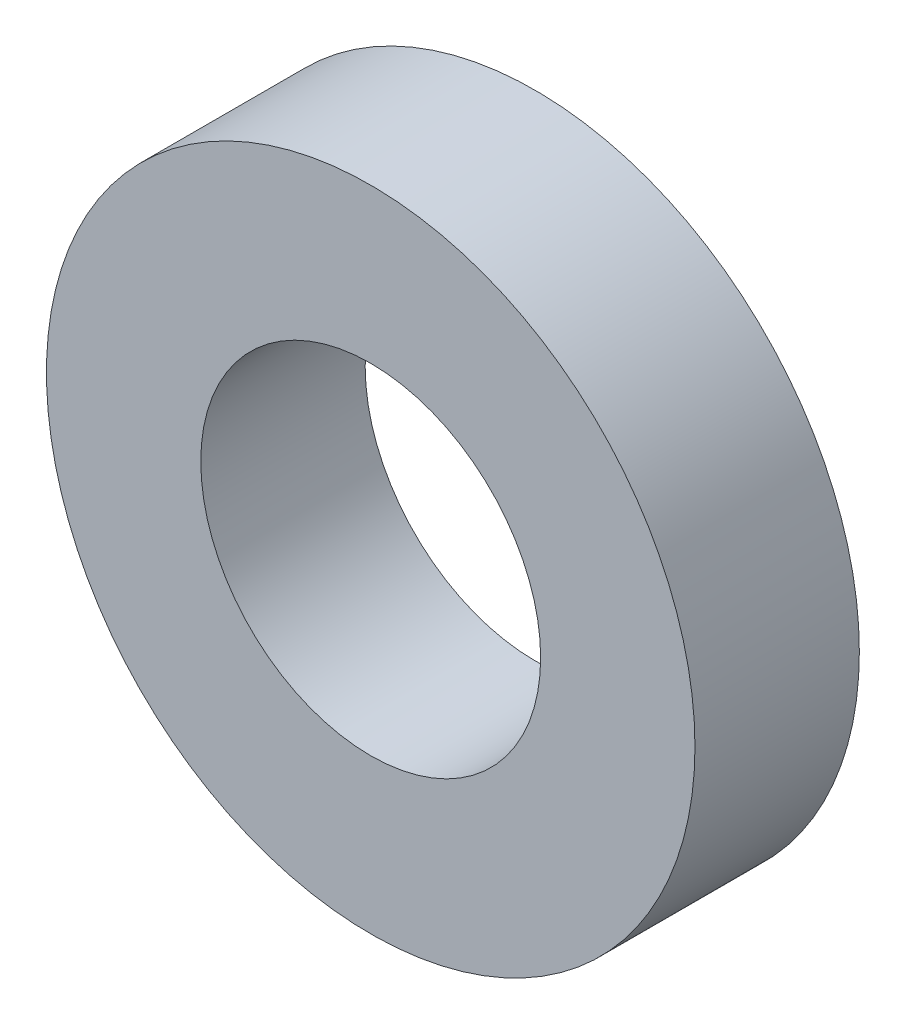
ISO-10303-21;
HEADER;
FILE_DESCRIPTION(('STEP AP214'),'2;1');
FILE_NAME('part.step','',(''),(''),'','','');
FILE_SCHEMA(('AUTOMOTIVE_DESIGN { 1 0 10303 214 1 1 1 1 }'));
ENDSEC;
DATA;
#1=APPLICATION_CONTEXT('core data for automotive mechanical design processes');
#2=APPLICATION_PROTOCOL_DEFINITION('international standard','automotive_design',2000,#1);
#3=PRODUCT_CONTEXT('',#1,'mechanical');
#4=PRODUCT('Part','Part','',(#3));
#5=PRODUCT_RELATED_PRODUCT_CATEGORY('part','',(#4));
#6=PRODUCT_DEFINITION_FORMATION('','',#4);
#7=PRODUCT_DEFINITION_CONTEXT('part definition',#1,'design');
#8=PRODUCT_DEFINITION('design','',#6,#7);
#9=PRODUCT_DEFINITION_SHAPE('','',#8);
#10=(LENGTH_UNIT() NAMED_UNIT(*) SI_UNIT(.MILLI.,.METRE.));
#11=(NAMED_UNIT(*) PLANE_ANGLE_UNIT() SI_UNIT($,.RADIAN.));
#12=(NAMED_UNIT(*) SI_UNIT($,.STERADIAN.) SOLID_ANGLE_UNIT());
#13=UNCERTAINTY_MEASURE_WITH_UNIT(LENGTH_MEASURE(1.E-05),#10,'distance_accuracy_value','');
#14=(GEOMETRIC_REPRESENTATION_CONTEXT(3) GLOBAL_UNCERTAINTY_ASSIGNED_CONTEXT((#13)) GLOBAL_UNIT_ASSIGNED_CONTEXT((#10,
#11,#12)) REPRESENTATION_CONTEXT('',''));
#15=CARTESIAN_POINT('',(0.,0.,0.));
#16=DIRECTION('',(0.,0.,1.));
#17=DIRECTION('',(1.,0.,0.));
#18=AXIS2_PLACEMENT_3D('',#15,#16,#17);
#19=CARTESIAN_POINT('',(0.,0.,4.));
#20=DIRECTION('',(0.,0.,1.));
#21=DIRECTION('',(1.,0.,0.));
#22=AXIS2_PLACEMENT_3D('',#19,#20,#21);
#23=PLANE('',#22);
#24=CARTESIAN_POINT('',(0.,0.,4.));
#25=DIRECTION('',(0.,0.,1.));
#26=DIRECTION('',(1.,0.,0.));
#27=AXIS2_PLACEMENT_3D('',#24,#25,#26);
#28=CIRCLE('',#27,7.89);
#29=CARTESIAN_POINT('',(7.89,0.,4.));
#30=VERTEX_POINT('',#29);
#31=EDGE_CURVE('E10',#30,#30,#28,.T.);
#32=ORIENTED_EDGE('',*,*,#31,.T.);
#33=EDGE_LOOP('',(#32));
#34=FACE_BOUND('',#33,.T.);
#35=CARTESIAN_POINT('',(0.,0.,4.));
#36=DIRECTION('',(0.,0.,1.));
#37=DIRECTION('',(1.,0.,0.));
#38=AXIS2_PLACEMENT_3D('',#35,#36,#37);
#39=CIRCLE('',#38,4.135);
#40=CARTESIAN_POINT('',(4.135,0.,4.));
#41=VERTEX_POINT('',#40);
#42=EDGE_CURVE('E48',#41,#41,#39,.T.);
#43=ORIENTED_EDGE('',*,*,#42,.F.);
#44=EDGE_LOOP('',(#43));
#45=FACE_BOUND('',#44,.T.);
#46=ADVANCED_FACE('F37',(#34,#45),#23,.T.);
#47=CARTESIAN_POINT('',(0.,0.,0.));
#48=DIRECTION('',(0.,0.,1.));
#49=DIRECTION('',(1.,0.,0.));
#50=AXIS2_PLACEMENT_3D('',#47,#48,#49);
#51=PLANE('',#50);
#52=CARTESIAN_POINT('',(0.,0.,0.));
#53=DIRECTION('',(0.,0.,1.));
#54=DIRECTION('',(1.,0.,0.));
#55=AXIS2_PLACEMENT_3D('',#52,#53,#54);
#56=CIRCLE('',#55,7.89);
#57=CARTESIAN_POINT('',(7.89,0.,0.));
#58=VERTEX_POINT('',#57);
#59=EDGE_CURVE('E41',#58,#58,#56,.T.);
#60=ORIENTED_EDGE('',*,*,#59,.F.);
#61=EDGE_LOOP('',(#60));
#62=FACE_BOUND('',#61,.T.);
#63=CARTESIAN_POINT('',(0.,0.,0.));
#64=DIRECTION('',(0.,0.,1.));
#65=DIRECTION('',(1.,0.,0.));
#66=AXIS2_PLACEMENT_3D('',#63,#64,#65);
#67=CIRCLE('',#66,4.135);
#68=CARTESIAN_POINT('',(4.135,0.,0.));
#69=VERTEX_POINT('',#68);
#70=EDGE_CURVE('E50',#69,#69,#67,.T.);
#71=ORIENTED_EDGE('',*,*,#70,.T.);
#72=EDGE_LOOP('',(#71));
#73=FACE_BOUND('',#72,.T.);
#74=ADVANCED_FACE('F60',(#62,#73),#51,.F.);
#75=CARTESIAN_POINT('',(0.,0.,4.));
#76=DIRECTION('',(0.,0.,-1.));
#77=DIRECTION('',(-1.,0.,0.));
#78=AXIS2_PLACEMENT_3D('',#75,#76,#77);
#79=CYLINDRICAL_SURFACE('',#78,7.89);
#80=ORIENTED_EDGE('',*,*,#31,.F.);
#81=EDGE_LOOP('',(#80));
#82=FACE_BOUND('',#81,.T.);
#83=ORIENTED_EDGE('',*,*,#59,.T.);
#84=EDGE_LOOP('',(#83));
#85=FACE_BOUND('',#84,.T.);
#86=ADVANCED_FACE('F39',(#82,#85),#79,.T.);
#87=CARTESIAN_POINT('',(0.,0.,4.));
#88=DIRECTION('',(0.,0.,-1.));
#89=DIRECTION('',(-1.,0.,0.));
#90=AXIS2_PLACEMENT_3D('',#87,#88,#89);
#91=CYLINDRICAL_SURFACE('',#90,4.135);
#92=ORIENTED_EDGE('',*,*,#42,.T.);
#93=EDGE_LOOP('',(#92));
#94=FACE_BOUND('',#93,.T.);
#95=ORIENTED_EDGE('',*,*,#70,.F.);
#96=EDGE_LOOP('',(#95));
#97=FACE_BOUND('',#96,.T.);
#98=ADVANCED_FACE('F56',(#94,#97),#91,.F.);
#99=CLOSED_SHELL('',(#46,#74,#86,#98));
#100=MANIFOLD_SOLID_BREP('B2',#99);
#101=ADVANCED_BREP_SHAPE_REPRESENTATION('',(#18,#100),#14);
#102=SHAPE_DEFINITION_REPRESENTATION(#9,#101);
ENDSEC;
END-ISO-10303-21;
